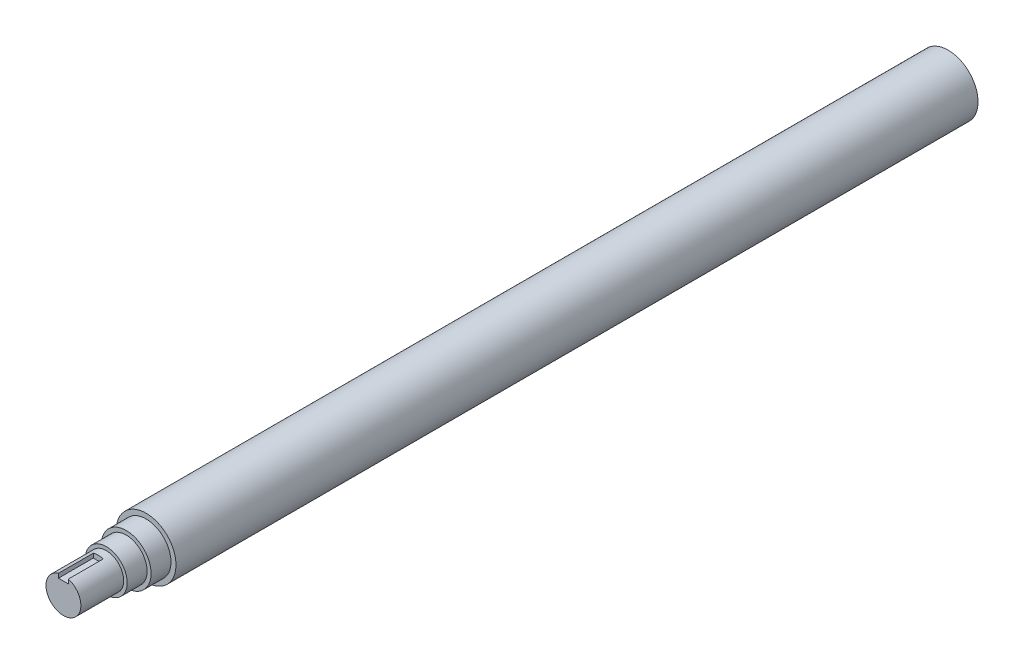
ISO-10303-21;
HEADER;
FILE_DESCRIPTION(('STEP AP214'),'2;1');
FILE_NAME('part.step','',(''),(''),'','','');
FILE_SCHEMA(('AUTOMOTIVE_DESIGN { 1 0 10303 214 1 1 1 1 }'));
ENDSEC;
DATA;
#1=APPLICATION_CONTEXT('core data for automotive mechanical design processes');
#2=APPLICATION_PROTOCOL_DEFINITION('international standard','automotive_design',2000,#1);
#3=PRODUCT_CONTEXT('',#1,'mechanical');
#4=PRODUCT('Part','Part','',(#3));
#5=PRODUCT_RELATED_PRODUCT_CATEGORY('part','',(#4));
#6=PRODUCT_DEFINITION_FORMATION('','',#4);
#7=PRODUCT_DEFINITION_CONTEXT('part definition',#1,'design');
#8=PRODUCT_DEFINITION('design','',#6,#7);
#9=PRODUCT_DEFINITION_SHAPE('','',#8);
#10=(LENGTH_UNIT() NAMED_UNIT(*) SI_UNIT(.MILLI.,.METRE.));
#11=(NAMED_UNIT(*) PLANE_ANGLE_UNIT() SI_UNIT($,.RADIAN.));
#12=(NAMED_UNIT(*) SI_UNIT($,.STERADIAN.) SOLID_ANGLE_UNIT());
#13=UNCERTAINTY_MEASURE_WITH_UNIT(LENGTH_MEASURE(1.E-05),#10,'distance_accuracy_value','');
#14=(GEOMETRIC_REPRESENTATION_CONTEXT(3) GLOBAL_UNCERTAINTY_ASSIGNED_CONTEXT((#13)) GLOBAL_UNIT_ASSIGNED_CONTEXT((#10,
#11,#12)) REPRESENTATION_CONTEXT('',''));
#15=CARTESIAN_POINT('',(0.,0.,0.));
#16=DIRECTION('',(0.,0.,1.));
#17=DIRECTION('',(1.,0.,0.));
#18=AXIS2_PLACEMENT_3D('',#15,#16,#17);
#19=CARTESIAN_POINT('',(-5.,12.5,43.));
#20=DIRECTION('',(0.,-1.,0.));
#21=DIRECTION('',(0.,0.,-1.));
#22=AXIS2_PLACEMENT_3D('',#19,#20,#21);
#23=PLANE('',#22);
#24=DIRECTION('',(1.,0.,0.));
#25=VECTOR('',#24,1.);
#26=CARTESIAN_POINT('',(0.,12.5,43.));
#27=LINE('',#26,#25);
#28=CARTESIAN_POINT('',(5.,12.5,43.));
#29=VERTEX_POINT('',#28);
#30=CARTESIAN_POINT('',(-5.,12.5,43.));
#31=VERTEX_POINT('',#30);
#32=EDGE_CURVE('E67',#29,#31,#27,.F.);
#33=ORIENTED_EDGE('',*,*,#32,.F.);
#34=DIRECTION('',(0.,0.,-1.));
#35=VECTOR('',#34,1.);
#36=CARTESIAN_POINT('',(5.,12.5,43.));
#37=LINE('',#36,#35);
#38=CARTESIAN_POINT('',(5.,12.5,8.));
#39=VERTEX_POINT('',#38);
#40=EDGE_CURVE('E63',#29,#39,#37,.T.);
#41=ORIENTED_EDGE('',*,*,#40,.T.);
#42=DIRECTION('',(1.,0.,0.));
#43=VECTOR('',#42,1.);
#44=CARTESIAN_POINT('',(0.,12.5,8.));
#45=LINE('',#44,#43);
#46=CARTESIAN_POINT('',(-5.,12.5,8.));
#47=VERTEX_POINT('',#46);
#48=EDGE_CURVE('E65',#47,#39,#45,.T.);
#49=ORIENTED_EDGE('',*,*,#48,.F.);
#50=DIRECTION('',(0.,0.,1.));
#51=VECTOR('',#50,1.);
#52=CARTESIAN_POINT('',(-5.,12.5,43.));
#53=LINE('',#52,#51);
#54=EDGE_CURVE('E56',#47,#31,#53,.T.);
#55=ORIENTED_EDGE('',*,*,#54,.T.);
#56=EDGE_LOOP('',(#33,#41,#49,#55));
#57=FACE_BOUND('',#56,.T.);
#58=ADVANCED_FACE('F16',(#57),#23,.F.);
#59=CARTESIAN_POINT('',(5.,12.5,43.));
#60=DIRECTION('',(1.,0.,0.));
#61=DIRECTION('',(0.,0.,-1.));
#62=AXIS2_PLACEMENT_3D('',#59,#60,#61);
#63=PLANE('',#62);
#64=DIRECTION('',(0.,1.,0.));
#65=VECTOR('',#64,1.);
#66=CARTESIAN_POINT('',(5.,0.,8.));
#67=LINE('',#66,#65);
#68=CARTESIAN_POINT('',(4.99999999999979,16.7705098312485,8.));
#69=VERTEX_POINT('',#68);
#70=EDGE_CURVE('E70',#39,#69,#67,.T.);
#71=ORIENTED_EDGE('',*,*,#70,.F.);
#72=ORIENTED_EDGE('',*,*,#40,.F.);
#73=DIRECTION('',(0.,1.,0.));
#74=VECTOR('',#73,1.);
#75=CARTESIAN_POINT('',(5.,0.,43.));
#76=LINE('',#75,#74);
#77=CARTESIAN_POINT('',(4.99999999999979,16.7705098312485,43.));
#78=VERTEX_POINT('',#77);
#79=EDGE_CURVE('E74',#78,#29,#76,.F.);
#80=ORIENTED_EDGE('',*,*,#79,.F.);
#81=DIRECTION('',(0.,0.,1.));
#82=VECTOR('',#81,1.);
#83=CARTESIAN_POINT('',(4.99999999999957,16.7705098312486,0.));
#84=LINE('',#83,#82);
#85=EDGE_CURVE('E48',#69,#78,#84,.T.);
#86=ORIENTED_EDGE('',*,*,#85,.F.);
#87=EDGE_LOOP('',(#71,#72,#80,#86));
#88=FACE_BOUND('',#87,.T.);
#89=ADVANCED_FACE('F71',(#88),#63,.F.);
#90=CARTESIAN_POINT('',(-5.,16.77050983125,43.));
#91=DIRECTION('',(-1.,0.,0.));
#92=DIRECTION('',(0.,0.,1.));
#93=AXIS2_PLACEMENT_3D('',#90,#91,#92);
#94=PLANE('',#93);
#95=DIRECTION('',(0.,1.,0.));
#96=VECTOR('',#95,1.);
#97=CARTESIAN_POINT('',(-5.,0.,8.));
#98=LINE('',#97,#96);
#99=CARTESIAN_POINT('',(-4.99999999999978,16.7705098312485,8.));
#100=VERTEX_POINT('',#99);
#101=EDGE_CURVE('E34',#100,#47,#98,.F.);
#102=ORIENTED_EDGE('',*,*,#101,.F.);
#103=DIRECTION('',(0.,0.,1.));
#104=VECTOR('',#103,1.);
#105=CARTESIAN_POINT('',(-4.99999999999957,16.7705098312486,0.));
#106=LINE('',#105,#104);
#107=CARTESIAN_POINT('',(-4.99999999999978,16.7705098312485,43.));
#108=VERTEX_POINT('',#107);
#109=EDGE_CURVE('E104',#108,#100,#106,.F.);
#110=ORIENTED_EDGE('',*,*,#109,.F.);
#111=DIRECTION('',(0.,1.,0.));
#112=VECTOR('',#111,1.);
#113=CARTESIAN_POINT('',(-5.,0.,43.));
#114=LINE('',#113,#112);
#115=EDGE_CURVE('E106',#31,#108,#114,.T.);
#116=ORIENTED_EDGE('',*,*,#115,.F.);
#117=ORIENTED_EDGE('',*,*,#54,.F.);
#118=EDGE_LOOP('',(#102,#110,#116,#117));
#119=FACE_BOUND('',#118,.T.);
#120=ADVANCED_FACE('F178',(#119),#94,.F.);
#121=CARTESIAN_POINT('',(0.,0.,8.));
#122=DIRECTION('',(0.,0.,1.));
#123=DIRECTION('',(1.,0.,0.));
#124=AXIS2_PLACEMENT_3D('',#121,#122,#123);
#125=PLANE('',#124);
#126=ORIENTED_EDGE('',*,*,#70,.T.);
#127=CARTESIAN_POINT('',(0.,0.,8.));
#128=DIRECTION('',(0.,0.,1.));
#129=DIRECTION('',(1.,0.,0.));
#130=AXIS2_PLACEMENT_3D('',#127,#128,#129);
#131=CIRCLE('',#130,17.5);
#132=EDGE_CURVE('E19',#100,#69,#131,.F.);
#133=ORIENTED_EDGE('',*,*,#132,.F.);
#134=ORIENTED_EDGE('',*,*,#101,.T.);
#135=ORIENTED_EDGE('',*,*,#48,.T.);
#136=EDGE_LOOP('',(#126,#133,#134,#135));
#137=FACE_BOUND('',#136,.T.);
#138=ADVANCED_FACE('F76',(#137),#125,.T.);
#139=CARTESIAN_POINT('',(0.,0.,43.));
#140=DIRECTION('',(0.,0.,1.));
#141=DIRECTION('',(1.,0.,0.));
#142=AXIS2_PLACEMENT_3D('',#139,#140,#141);
#143=PLANE('',#142);
#144=ORIENTED_EDGE('',*,*,#32,.T.);
#145=ORIENTED_EDGE('',*,*,#115,.T.);
#146=CARTESIAN_POINT('',(0.,0.,43.));
#147=DIRECTION('',(0.,0.,1.));
#148=DIRECTION('',(1.,0.,0.));
#149=AXIS2_PLACEMENT_3D('',#146,#147,#148);
#150=CIRCLE('',#149,17.5);
#151=EDGE_CURVE('E100',#78,#108,#150,.F.);
#152=ORIENTED_EDGE('',*,*,#151,.F.);
#153=ORIENTED_EDGE('',*,*,#79,.T.);
#154=EDGE_LOOP('',(#144,#145,#152,#153));
#155=FACE_BOUND('',#154,.T.);
#156=ADVANCED_FACE('F125',(#155),#143,.T.);
#157=CARTESIAN_POINT('',(0.,0.,0.));
#158=DIRECTION('',(0.,0.,1.));
#159=DIRECTION('',(1.,0.,0.));
#160=AXIS2_PLACEMENT_3D('',#157,#158,#159);
#161=CYLINDRICAL_SURFACE('',#160,17.5);
#162=ORIENTED_EDGE('',*,*,#85,.T.);
#163=ORIENTED_EDGE('',*,*,#151,.T.);
#164=ORIENTED_EDGE('',*,*,#109,.T.);
#165=ORIENTED_EDGE('',*,*,#132,.T.);
#166=EDGE_LOOP('',(#162,#163,#164,#165));
#167=FACE_BOUND('',#166,.T.);
#168=CARTESIAN_POINT('',(0.,0.,0.));
#169=DIRECTION('',(0.,0.,1.));
#170=DIRECTION('',(1.,0.,0.));
#171=AXIS2_PLACEMENT_3D('',#168,#169,#170);
#172=CIRCLE('',#171,17.5);
#173=CARTESIAN_POINT('',(17.5,0.,0.));
#174=VERTEX_POINT('',#173);
#175=EDGE_CURVE('E98',#174,#174,#172,.T.);
#176=ORIENTED_EDGE('',*,*,#175,.T.);
#177=EDGE_LOOP('',(#176));
#178=FACE_BOUND('',#177,.T.);
#179=ADVANCED_FACE('F126',(#167,#178),#161,.T.);
#180=CARTESIAN_POINT('',(0.,0.,0.));
#181=DIRECTION('',(0.,0.,-1.));
#182=DIRECTION('',(-1.,0.,0.));
#183=AXIS2_PLACEMENT_3D('',#180,#181,#182);
#184=PLANE('',#183);
#185=ORIENTED_EDGE('',*,*,#175,.F.);
#186=EDGE_LOOP('',(#185));
#187=FACE_BOUND('',#186,.T.);
#188=CARTESIAN_POINT('',(0.,0.,0.));
#189=DIRECTION('',(0.,0.,-1.));
#190=DIRECTION('',(-1.,0.,0.));
#191=AXIS2_PLACEMENT_3D('',#188,#189,#190);
#192=CIRCLE('',#191,21.);
#193=CARTESIAN_POINT('',(-21.,0.,0.));
#194=VERTEX_POINT('',#193);
#195=EDGE_CURVE('E95',#194,#194,#192,.T.);
#196=ORIENTED_EDGE('',*,*,#195,.F.);
#197=EDGE_LOOP('',(#196));
#198=FACE_BOUND('',#197,.T.);
#199=ADVANCED_FACE('F129',(#187,#198),#184,.F.);
#200=CARTESIAN_POINT('',(0.,0.,0.));
#201=DIRECTION('',(0.,0.,-1.));
#202=DIRECTION('',(-1.,0.,0.));
#203=AXIS2_PLACEMENT_3D('',#200,#201,#202);
#204=CYLINDRICAL_SURFACE('',#203,21.);
#205=ORIENTED_EDGE('',*,*,#195,.T.);
#206=EDGE_LOOP('',(#205));
#207=FACE_BOUND('',#206,.T.);
#208=CARTESIAN_POINT('',(0.,0.,-20.));
#209=DIRECTION('',(0.,0.,-1.));
#210=DIRECTION('',(-1.,0.,0.));
#211=AXIS2_PLACEMENT_3D('',#208,#209,#210);
#212=CIRCLE('',#211,21.);
#213=CARTESIAN_POINT('',(-21.,0.,-20.));
#214=VERTEX_POINT('',#213);
#215=EDGE_CURVE('E92',#214,#214,#212,.F.);
#216=ORIENTED_EDGE('',*,*,#215,.T.);
#217=EDGE_LOOP('',(#216));
#218=FACE_BOUND('',#217,.T.);
#219=ADVANCED_FACE('F135',(#207,#218),#204,.T.);
#220=CARTESIAN_POINT('',(0.,0.,-20.));
#221=DIRECTION('',(0.,0.,-1.));
#222=DIRECTION('',(-1.,0.,0.));
#223=AXIS2_PLACEMENT_3D('',#220,#221,#222);
#224=PLANE('',#223);
#225=ORIENTED_EDGE('',*,*,#215,.F.);
#226=EDGE_LOOP('',(#225));
#227=FACE_BOUND('',#226,.T.);
#228=CARTESIAN_POINT('',(0.,0.,-20.));
#229=DIRECTION('',(0.,0.,-1.));
#230=DIRECTION('',(-1.,0.,0.));
#231=AXIS2_PLACEMENT_3D('',#228,#229,#230);
#232=CIRCLE('',#231,25.);
#233=CARTESIAN_POINT('',(-25.,0.,-20.));
#234=VERTEX_POINT('',#233);
#235=EDGE_CURVE('E89',#234,#234,#232,.T.);
#236=ORIENTED_EDGE('',*,*,#235,.F.);
#237=EDGE_LOOP('',(#236));
#238=FACE_BOUND('',#237,.T.);
#239=ADVANCED_FACE('F141',(#227,#238),#224,.F.);
#240=CARTESIAN_POINT('',(0.,0.,-20.));
#241=DIRECTION('',(0.,0.,-1.));
#242=DIRECTION('',(-1.,0.,0.));
#243=AXIS2_PLACEMENT_3D('',#240,#241,#242);
#244=CYLINDRICAL_SURFACE('',#243,25.);
#245=ORIENTED_EDGE('',*,*,#235,.T.);
#246=EDGE_LOOP('',(#245));
#247=FACE_BOUND('',#246,.T.);
#248=CARTESIAN_POINT('',(0.,0.,-40.));
#249=DIRECTION('',(0.,0.,-1.));
#250=DIRECTION('',(-1.,0.,0.));
#251=AXIS2_PLACEMENT_3D('',#248,#249,#250);
#252=CIRCLE('',#251,25.);
#253=CARTESIAN_POINT('',(-25.,0.,-40.));
#254=VERTEX_POINT('',#253);
#255=EDGE_CURVE('E86',#254,#254,#252,.F.);
#256=ORIENTED_EDGE('',*,*,#255,.T.);
#257=EDGE_LOOP('',(#256));
#258=FACE_BOUND('',#257,.T.);
#259=ADVANCED_FACE('F147',(#247,#258),#244,.T.);
#260=CARTESIAN_POINT('',(0.,0.,-845.));
#261=DIRECTION('',(0.,0.,-1.));
#262=DIRECTION('',(-1.,0.,0.));
#263=AXIS2_PLACEMENT_3D('',#260,#261,#262);
#264=PLANE('',#263);
#265=CARTESIAN_POINT('',(0.,0.,-845.));
#266=DIRECTION('',(0.,0.,-1.));
#267=DIRECTION('',(-1.,0.,0.));
#268=AXIS2_PLACEMENT_3D('',#265,#266,#267);
#269=CIRCLE('',#268,30.);
#270=CARTESIAN_POINT('',(-30.,0.,-845.));
#271=VERTEX_POINT('',#270);
#272=EDGE_CURVE('E25',#271,#271,#269,.F.);
#273=ORIENTED_EDGE('',*,*,#272,.F.);
#274=EDGE_LOOP('',(#273));
#275=FACE_BOUND('',#274,.T.);
#276=ADVANCED_FACE('F153',(#275),#264,.T.);
#277=CARTESIAN_POINT('',(0.,0.,-40.));
#278=DIRECTION('',(0.,0.,-1.));
#279=DIRECTION('',(-1.,0.,0.));
#280=AXIS2_PLACEMENT_3D('',#277,#278,#279);
#281=PLANE('',#280);
#282=ORIENTED_EDGE('',*,*,#255,.F.);
#283=EDGE_LOOP('',(#282));
#284=FACE_BOUND('',#283,.T.);
#285=CARTESIAN_POINT('',(0.,0.,-40.));
#286=DIRECTION('',(0.,0.,-1.));
#287=DIRECTION('',(-1.,0.,0.));
#288=AXIS2_PLACEMENT_3D('',#285,#286,#287);
#289=CIRCLE('',#288,30.);
#290=CARTESIAN_POINT('',(-30.,0.,-40.));
#291=VERTEX_POINT('',#290);
#292=EDGE_CURVE('E10',#291,#291,#289,.T.);
#293=ORIENTED_EDGE('',*,*,#292,.F.);
#294=EDGE_LOOP('',(#293));
#295=FACE_BOUND('',#294,.T.);
#296=ADVANCED_FACE('F157',(#284,#295),#281,.F.);
#297=CARTESIAN_POINT('',(0.,0.,-40.));
#298=DIRECTION('',(0.,0.,-1.));
#299=DIRECTION('',(-1.,0.,0.));
#300=AXIS2_PLACEMENT_3D('',#297,#298,#299);
#301=CYLINDRICAL_SURFACE('',#300,30.);
#302=ORIENTED_EDGE('',*,*,#272,.T.);
#303=EDGE_LOOP('',(#302));
#304=FACE_BOUND('',#303,.T.);
#305=ORIENTED_EDGE('',*,*,#292,.T.);
#306=EDGE_LOOP('',(#305));
#307=FACE_BOUND('',#306,.T.);
#308=ADVANCED_FACE('F160',(#304,#307),#301,.T.);
#309=CLOSED_SHELL('',(#58,#89,#120,#138,#156,#179,#199,#219,#239,#259,#276,#296,#308));
#310=MANIFOLD_SOLID_BREP('B1',#309);
#311=ADVANCED_BREP_SHAPE_REPRESENTATION('',(#18,#310),#14);
#312=SHAPE_DEFINITION_REPRESENTATION(#9,#311);
ENDSEC;
END-ISO-10303-21;
